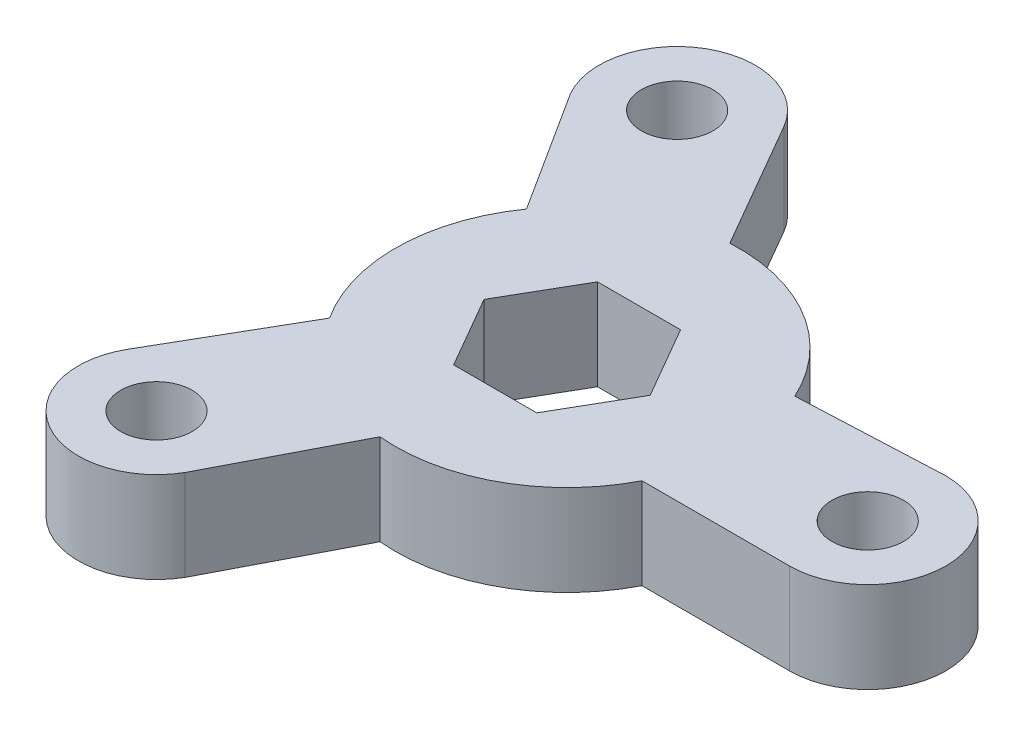
ISO-10303-21;
HEADER;
FILE_DESCRIPTION(('STEP AP214'),'2;1');
FILE_NAME('part.step','',(''),(''),'','','');
FILE_SCHEMA(('AUTOMOTIVE_DESIGN { 1 0 10303 214 1 1 1 1 }'));
ENDSEC;
DATA;
#1=APPLICATION_CONTEXT('core data for automotive mechanical design processes');
#2=APPLICATION_PROTOCOL_DEFINITION('international standard','automotive_design',2000,#1);
#3=PRODUCT_CONTEXT('',#1,'mechanical');
#4=PRODUCT('Part','Part','',(#3));
#5=PRODUCT_RELATED_PRODUCT_CATEGORY('part','',(#4));
#6=PRODUCT_DEFINITION_FORMATION('','',#4);
#7=PRODUCT_DEFINITION_CONTEXT('part definition',#1,'design');
#8=PRODUCT_DEFINITION('design','',#6,#7);
#9=PRODUCT_DEFINITION_SHAPE('','',#8);
#10=(LENGTH_UNIT() NAMED_UNIT(*) SI_UNIT(.MILLI.,.METRE.));
#11=(NAMED_UNIT(*) PLANE_ANGLE_UNIT() SI_UNIT($,.RADIAN.));
#12=(NAMED_UNIT(*) SI_UNIT($,.STERADIAN.) SOLID_ANGLE_UNIT());
#13=UNCERTAINTY_MEASURE_WITH_UNIT(LENGTH_MEASURE(1.E-05),#10,'distance_accuracy_value','');
#14=(GEOMETRIC_REPRESENTATION_CONTEXT(3) GLOBAL_UNCERTAINTY_ASSIGNED_CONTEXT((#13)) GLOBAL_UNIT_ASSIGNED_CONTEXT((#10,
#11,#12)) REPRESENTATION_CONTEXT('',''));
#15=CARTESIAN_POINT('',(0.,0.,0.));
#16=DIRECTION('',(0.,0.,1.));
#17=DIRECTION('',(1.,0.,0.));
#18=AXIS2_PLACEMENT_3D('',#15,#16,#17);
#19=CARTESIAN_POINT('',(4.16792281511756,3.175,-2.40635135926971));
#20=DIRECTION('',(-0.866025403784439,0.,0.5));
#21=DIRECTION('',(0.5,0.,0.866025403784439));
#22=AXIS2_PLACEMENT_3D('',#19,#20,#21);
#23=PLANE('',#22);
#24=DIRECTION('',(-0.5,0.,-0.866025403784439));
#25=VECTOR('',#24,1.);
#26=CARTESIAN_POINT('',(4.16792281511756,0.,-2.40635135926971));
#27=LINE('',#26,#25);
#28=CARTESIAN_POINT('',(5.41594714437485,0.,-0.244709811914002));
#29=VERTEX_POINT('',#28);
#30=CARTESIAN_POINT('',(3.96535459303568,0.,-2.75720981191441));
#31=VERTEX_POINT('',#30);
#32=EDGE_CURVE('E238',#29,#31,#27,.T.);
#33=ORIENTED_EDGE('',*,*,#32,.F.);
#34=DIRECTION('',(0.,-1.,0.));
#35=VECTOR('',#34,1.);
#36=CARTESIAN_POINT('',(5.41594714437485,3.175,-0.244709811914002));
#37=LINE('',#36,#35);
#38=CARTESIAN_POINT('',(5.41594714437485,3.175,-0.244709811914002));
#39=VERTEX_POINT('',#38);
#40=EDGE_CURVE('E11',#39,#29,#37,.T.);
#41=ORIENTED_EDGE('',*,*,#40,.F.);
#42=DIRECTION('',(-0.5,0.,-0.866025403784439));
#43=VECTOR('',#42,1.);
#44=CARTESIAN_POINT('',(4.16792281511756,3.175,-2.40635135926971));
#45=LINE('',#44,#43);
#46=CARTESIAN_POINT('',(3.96535459303568,3.175,-2.75720981191441));
#47=VERTEX_POINT('',#46);
#48=EDGE_CURVE('E339',#39,#47,#45,.T.);
#49=ORIENTED_EDGE('',*,*,#48,.T.);
#50=DIRECTION('',(0.,-1.,0.));
#51=VECTOR('',#50,1.);
#52=CARTESIAN_POINT('',(3.96535459303568,3.175,-2.75720981191441));
#53=LINE('',#52,#51);
#54=EDGE_CURVE('E54',#47,#31,#53,.T.);
#55=ORIENTED_EDGE('',*,*,#54,.T.);
#56=EDGE_LOOP('',(#33,#41,#49,#55));
#57=FACE_BOUND('',#56,.T.);
#58=ADVANCED_FACE('F35',(#57),#23,.T.);
#59=CARTESIAN_POINT('',(3.95599790144547,3.175,2.28399645331314));
#60=DIRECTION('',(-0.866025403784439,0.,-0.5));
#61=DIRECTION('',(-0.5,0.,0.866025403784439));
#62=AXIS2_PLACEMENT_3D('',#59,#60,#61);
#63=PLANE('',#62);
#64=DIRECTION('',(0.5,0.,-0.866025403784439));
#65=VECTOR('',#64,1.);
#66=CARTESIAN_POINT('',(3.95599790144547,0.,2.28399645331314));
#67=LINE('',#66,#65);
#68=CARTESIAN_POINT('',(3.96535459303568,0.,2.26779018808813));
#69=VERTEX_POINT('',#68);
#70=EDGE_CURVE('E240',#69,#29,#67,.T.);
#71=ORIENTED_EDGE('',*,*,#70,.F.);
#72=DIRECTION('',(0.,-1.,0.));
#73=VECTOR('',#72,1.);
#74=CARTESIAN_POINT('',(3.96535459303568,3.175,2.26779018808813));
#75=LINE('',#74,#73);
#76=CARTESIAN_POINT('',(3.96535459303568,3.175,2.26779018808813));
#77=VERTEX_POINT('',#76);
#78=EDGE_CURVE('E45',#77,#69,#75,.T.);
#79=ORIENTED_EDGE('',*,*,#78,.F.);
#80=DIRECTION('',(0.5,0.,-0.866025403784439));
#81=VECTOR('',#80,1.);
#82=CARTESIAN_POINT('',(3.95599790144547,3.175,2.28399645331314));
#83=LINE('',#82,#81);
#84=EDGE_CURVE('E341',#77,#39,#83,.T.);
#85=ORIENTED_EDGE('',*,*,#84,.T.);
#86=ORIENTED_EDGE('',*,*,#40,.T.);
#87=EDGE_LOOP('',(#71,#79,#85,#86));
#88=FACE_BOUND('',#87,.T.);
#89=ADVANCED_FACE('F365',(#88),#63,.T.);
#90=CARTESIAN_POINT('',(0.,3.175,2.26779018808813));
#91=DIRECTION('',(0.,0.,-1.));
#92=DIRECTION('',(-1.,0.,0.));
#93=AXIS2_PLACEMENT_3D('',#90,#91,#92);
#94=PLANE('',#93);
#95=DIRECTION('',(1.,0.,0.));
#96=VECTOR('',#95,1.);
#97=CARTESIAN_POINT('',(0.,0.,2.26779018808813));
#98=LINE('',#97,#96);
#99=CARTESIAN_POINT('',(1.06416949035638,0.,2.26779018808819));
#100=VERTEX_POINT('',#99);
#101=EDGE_CURVE('E243',#100,#69,#98,.T.);
#102=ORIENTED_EDGE('',*,*,#101,.F.);
#103=DIRECTION('',(0.,-1.,0.));
#104=VECTOR('',#103,1.);
#105=CARTESIAN_POINT('',(1.06416949035638,3.175,2.26779018808819));
#106=LINE('',#105,#104);
#107=CARTESIAN_POINT('',(1.06416949035638,3.175,2.26779018808819));
#108=VERTEX_POINT('',#107);
#109=EDGE_CURVE('E177',#108,#100,#106,.T.);
#110=ORIENTED_EDGE('',*,*,#109,.F.);
#111=DIRECTION('',(1.,0.,0.));
#112=VECTOR('',#111,1.);
#113=CARTESIAN_POINT('',(0.,3.175,2.26779018808813));
#114=LINE('',#113,#112);
#115=EDGE_CURVE('E189',#108,#77,#114,.T.);
#116=ORIENTED_EDGE('',*,*,#115,.T.);
#117=ORIENTED_EDGE('',*,*,#78,.T.);
#118=EDGE_LOOP('',(#102,#110,#116,#117));
#119=FACE_BOUND('',#118,.T.);
#120=ADVANCED_FACE('F345',(#119),#94,.T.);
#121=CARTESIAN_POINT('',(-0.183854838901459,3.175,0.106148640731575));
#122=DIRECTION('',(0.866025403784435,0.,-0.500000000000006));
#123=DIRECTION('',(-0.500000000000006,0.,-0.866025403784435));
#124=AXIS2_PLACEMENT_3D('',#121,#122,#123);
#125=PLANE('',#124);
#126=DIRECTION('',(0.500000000000006,0.,0.866025403784435));
#127=VECTOR('',#126,1.);
#128=CARTESIAN_POINT('',(-0.183854838901459,0.,0.106148640731575));
#129=LINE('',#128,#127);
#130=CARTESIAN_POINT('',(-0.386423060983354,0.,-0.244709811913157));
#131=VERTEX_POINT('',#130);
#132=EDGE_CURVE('E173',#131,#100,#129,.T.);
#133=ORIENTED_EDGE('',*,*,#132,.F.);
#134=DIRECTION('',(0.,-1.,0.));
#135=VECTOR('',#134,1.);
#136=CARTESIAN_POINT('',(-0.386423060983354,3.175,-0.244709811913157));
#137=LINE('',#136,#135);
#138=CARTESIAN_POINT('',(-0.386423060983354,3.175,-0.244709811913157));
#139=VERTEX_POINT('',#138);
#140=EDGE_CURVE('E168',#139,#131,#137,.T.);
#141=ORIENTED_EDGE('',*,*,#140,.F.);
#142=DIRECTION('',(0.500000000000006,0.,0.866025403784435));
#143=VECTOR('',#142,1.);
#144=CARTESIAN_POINT('',(-0.183854838901459,3.175,0.106148640731575));
#145=LINE('',#144,#143);
#146=EDGE_CURVE('E171',#139,#108,#145,.T.);
#147=ORIENTED_EDGE('',*,*,#146,.T.);
#148=ORIENTED_EDGE('',*,*,#109,.T.);
#149=EDGE_LOOP('',(#133,#141,#147,#148));
#150=FACE_BOUND('',#149,.T.);
#151=ADVANCED_FACE('F170',(#150),#125,.T.);
#152=CARTESIAN_POINT('',(-0.395779752573566,3.175,-0.228503546688159));
#153=DIRECTION('',(0.866025403784432,0.,0.500000000000012));
#154=DIRECTION('',(0.500000000000012,0.,-0.866025403784432));
#155=AXIS2_PLACEMENT_3D('',#152,#153,#154);
#156=PLANE('',#155);
#157=DIRECTION('',(-0.500000000000012,0.,0.866025403784432));
#158=VECTOR('',#157,1.);
#159=CARTESIAN_POINT('',(-0.395779752573566,0.,-0.228503546688159));
#160=LINE('',#159,#158);
#161=CARTESIAN_POINT('',(1.06416949035712,0.,-2.75720981191441));
#162=VERTEX_POINT('',#161);
#163=EDGE_CURVE('E247',#162,#131,#160,.T.);
#164=ORIENTED_EDGE('',*,*,#163,.F.);
#165=DIRECTION('',(0.,-1.,0.));
#166=VECTOR('',#165,1.);
#167=CARTESIAN_POINT('',(1.06416949035712,3.175,-2.75720981191441));
#168=LINE('',#167,#166);
#169=CARTESIAN_POINT('',(1.06416949035712,3.175,-2.75720981191441));
#170=VERTEX_POINT('',#169);
#171=EDGE_CURVE('E109',#170,#162,#168,.T.);
#172=ORIENTED_EDGE('',*,*,#171,.F.);
#173=DIRECTION('',(-0.500000000000012,0.,0.866025403784432));
#174=VECTOR('',#173,1.);
#175=CARTESIAN_POINT('',(-0.395779752573566,3.175,-0.228503546688159));
#176=LINE('',#175,#174);
#177=EDGE_CURVE('E186',#170,#139,#176,.T.);
#178=ORIENTED_EDGE('',*,*,#177,.T.);
#179=ORIENTED_EDGE('',*,*,#140,.T.);
#180=EDGE_LOOP('',(#164,#172,#178,#179));
#181=FACE_BOUND('',#180,.T.);
#182=ADVANCED_FACE('F191',(#181),#156,.T.);
#183=CARTESIAN_POINT('',(3.87987291900672,3.175,2.01140464348408));
#184=DIRECTION('',(-0.887790184262467,0.,-0.460248398940414));
#185=DIRECTION('',(-0.460248398940414,0.,0.887790184262467));
#186=AXIS2_PLACEMENT_3D('',#183,#184,#185);
#187=PLANE('',#186);
#188=DIRECTION('',(0.460248398940414,0.,-0.887790184262467));
#189=VECTOR('',#188,1.);
#190=CARTESIAN_POINT('',(3.87987291900672,0.,2.01140464348408));
#191=LINE('',#190,#189);
#192=CARTESIAN_POINT('',(-0.371989304252298,0.,10.2129791744026));
#193=VERTEX_POINT('',#192);
#194=CARTESIAN_POINT('',(1.95264752249864,0.,5.72890109500861));
#195=VERTEX_POINT('',#194);
#196=EDGE_CURVE('E207',#193,#195,#191,.T.);
#197=ORIENTED_EDGE('',*,*,#196,.T.);
#198=DIRECTION('',(0.,-1.,0.));
#199=VECTOR('',#198,1.);
#200=CARTESIAN_POINT('',(1.95264752249864,3.175,5.72890109500861));
#201=LINE('',#200,#199);
#202=CARTESIAN_POINT('',(1.95264752249864,3.175,5.72890109500861));
#203=VERTEX_POINT('',#202);
#204=EDGE_CURVE('E39',#203,#195,#201,.T.);
#205=ORIENTED_EDGE('',*,*,#204,.F.);
#206=DIRECTION('',(0.460248398940414,0.,-0.887790184262467));
#207=VECTOR('',#206,1.);
#208=CARTESIAN_POINT('',(3.87987291900672,3.175,2.01140464348408));
#209=LINE('',#208,#207);
#210=CARTESIAN_POINT('',(-0.371989304252298,3.175,10.2129791744026));
#211=VERTEX_POINT('',#210);
#212=EDGE_CURVE('E261',#211,#203,#209,.T.);
#213=ORIENTED_EDGE('',*,*,#212,.F.);
#214=DIRECTION('',(0.,-1.,0.));
#215=VECTOR('',#214,1.);
#216=CARTESIAN_POINT('',(-0.371989304252298,3.175,10.2129791744026));
#217=LINE('',#216,#215);
#218=EDGE_CURVE('E206',#211,#193,#217,.T.);
#219=ORIENTED_EDGE('',*,*,#218,.T.);
#220=EDGE_LOOP('',(#197,#205,#213,#219));
#221=FACE_BOUND('',#220,.T.);
#222=ADVANCED_FACE('F37',(#221),#187,.F.);
#223=CARTESIAN_POINT('',(2.51476204169658,3.175,-0.244709811914002));
#224=DIRECTION('',(0.,-1.,0.));
#225=DIRECTION('',(0.,0.,-1.));
#226=AXIS2_PLACEMENT_3D('',#223,#224,#225);
#227=CYLINDRICAL_SURFACE('',#226,5.99999999999883);
#228=CARTESIAN_POINT('',(2.51476204169658,0.,-0.244709811914002));
#229=DIRECTION('',(0.,1.,0.));
#230=DIRECTION('',(0.,0.,1.));
#231=AXIS2_PLACEMENT_3D('',#228,#229,#230);
#232=CIRCLE('',#231,5.99999999999883);
#233=CARTESIAN_POINT('',(7.85830091889646,0.,2.48413468124454));
#234=VERTEX_POINT('',#233);
#235=EDGE_CURVE('E210',#195,#234,#232,.T.);
#236=ORIENTED_EDGE('',*,*,#235,.T.);
#237=DIRECTION('',(0.,-1.,0.));
#238=VECTOR('',#237,1.);
#239=CARTESIAN_POINT('',(7.85830091889646,3.175,2.48413468124454));
#240=LINE('',#239,#238);
#241=CARTESIAN_POINT('',(7.85830091889646,3.175,2.48413468124454));
#242=VERTEX_POINT('',#241);
#243=EDGE_CURVE('E289',#242,#234,#240,.T.);
#244=ORIENTED_EDGE('',*,*,#243,.F.);
#245=CARTESIAN_POINT('',(2.51476204169658,3.175,-0.244709811914002));
#246=DIRECTION('',(0.,1.,0.));
#247=DIRECTION('',(0.,0.,1.));
#248=AXIS2_PLACEMENT_3D('',#245,#246,#247);
#249=CIRCLE('',#248,5.99999999999883);
#250=EDGE_CURVE('E122',#203,#242,#249,.T.);
#251=ORIENTED_EDGE('',*,*,#250,.F.);
#252=ORIENTED_EDGE('',*,*,#204,.T.);
#253=EDGE_LOOP('',(#236,#244,#251,#252));
#254=FACE_BOUND('',#253,.T.);
#255=ADVANCED_FACE('F294',(#254),#227,.T.);
#256=CARTESIAN_POINT('',(0.,3.175,2.48413468124462));
#257=DIRECTION('',(0.,0.,1.));
#258=DIRECTION('',(1.,0.,0.));
#259=AXIS2_PLACEMENT_3D('',#256,#257,#258);
#260=PLANE('',#259);
#261=DIRECTION('',(-1.,0.,0.));
#262=VECTOR('',#261,1.);
#263=CARTESIAN_POINT('',(0.,0.,2.48413468124462));
#264=LINE('',#263,#262);
#265=CARTESIAN_POINT('',(13.0147620416956,0.,2.48413468124462));
#266=VERTEX_POINT('',#265);
#267=EDGE_CURVE('E213',#266,#234,#264,.T.);
#268=ORIENTED_EDGE('',*,*,#267,.F.);
#269=DIRECTION('',(0.,-1.,0.));
#270=VECTOR('',#269,1.);
#271=CARTESIAN_POINT('',(13.0147620416956,3.175,2.48413468124462));
#272=LINE('',#271,#270);
#273=CARTESIAN_POINT('',(13.0147620416956,3.175,2.48413468124462));
#274=VERTEX_POINT('',#273);
#275=EDGE_CURVE('E288',#274,#266,#272,.T.);
#276=ORIENTED_EDGE('',*,*,#275,.F.);
#277=DIRECTION('',(-1.,0.,0.));
#278=VECTOR('',#277,1.);
#279=CARTESIAN_POINT('',(0.,3.175,2.48413468124462));
#280=LINE('',#279,#278);
#281=EDGE_CURVE('E309',#274,#242,#280,.T.);
#282=ORIENTED_EDGE('',*,*,#281,.T.);
#283=ORIENTED_EDGE('',*,*,#243,.T.);
#284=EDGE_LOOP('',(#268,#276,#282,#283));
#285=FACE_BOUND('',#284,.T.);
#286=ADVANCED_FACE('F306',(#285),#260,.T.);
#287=CARTESIAN_POINT('',(13.0147620416956,3.175,-0.244709811913141));
#288=DIRECTION('',(0.,-1.,0.));
#289=DIRECTION('',(0.,0.,-1.));
#290=AXIS2_PLACEMENT_3D('',#287,#288,#289);
#291=CYLINDRICAL_SURFACE('',#290,2.72884449315776);
#292=CARTESIAN_POINT('',(13.0147620416956,0.,-0.244709811913141));
#293=DIRECTION('',(0.,1.,0.));
#294=DIRECTION('',(0.,0.,1.));
#295=AXIS2_PLACEMENT_3D('',#292,#293,#294);
#296=CIRCLE('',#295,2.72884449315776);
#297=CARTESIAN_POINT('',(13.0147620416966,0.,-2.97355430507091));
#298=VERTEX_POINT('',#297);
#299=EDGE_CURVE('E216',#266,#298,#296,.T.);
#300=ORIENTED_EDGE('',*,*,#299,.T.);
#301=DIRECTION('',(0.,-1.,0.));
#302=VECTOR('',#301,1.);
#303=CARTESIAN_POINT('',(13.0147620416966,3.175,-2.97355430507091));
#304=LINE('',#303,#302);
#305=CARTESIAN_POINT('',(13.0147620416966,3.175,-2.97355430507091));
#306=VERTEX_POINT('',#305);
#307=EDGE_CURVE('E285',#306,#298,#304,.T.);
#308=ORIENTED_EDGE('',*,*,#307,.F.);
#309=CARTESIAN_POINT('',(13.0147620416956,3.175,-0.244709811913141));
#310=DIRECTION('',(0.,1.,0.));
#311=DIRECTION('',(0.,0.,1.));
#312=AXIS2_PLACEMENT_3D('',#309,#310,#311);
#313=CIRCLE('',#312,2.72884449315776);
#314=EDGE_CURVE('E312',#274,#306,#313,.T.);
#315=ORIENTED_EDGE('',*,*,#314,.F.);
#316=ORIENTED_EDGE('',*,*,#275,.T.);
#317=EDGE_LOOP('',(#300,#308,#315,#316));
#318=FACE_BOUND('',#317,.T.);
#319=ADVANCED_FACE('F313',(#318),#291,.T.);
#320=CARTESIAN_POINT('',(-0.107871058470792,3.175,-2.37837906979592));
#321=DIRECTION('',(0.045308286597738,0.,0.998973052271971));
#322=DIRECTION('',(0.998973052271971,0.,-0.045308286597738));
#323=AXIS2_PLACEMENT_3D('',#320,#321,#322);
#324=PLANE('',#323);
#325=DIRECTION('',(-0.998973052271971,0.,0.045308286597738));
#326=VECTOR('',#325,1.);
#327=CARTESIAN_POINT('',(-0.107871058470792,0.,-2.37837906979592));
#328=LINE('',#327,#326);
#329=CARTESIAN_POINT('',(7.96911809901369,0.,-2.7447098119133));
#330=VERTEX_POINT('',#329);
#331=EDGE_CURVE('E218',#298,#330,#328,.T.);
#332=ORIENTED_EDGE('',*,*,#331,.T.);
#333=DIRECTION('',(0.,-1.,0.));
#334=VECTOR('',#333,1.);
#335=CARTESIAN_POINT('',(7.96911809901369,3.175,-2.7447098119133));
#336=LINE('',#335,#334);
#337=CARTESIAN_POINT('',(7.96911809901369,3.175,-2.7447098119133));
#338=VERTEX_POINT('',#337);
#339=EDGE_CURVE('E282',#338,#330,#336,.T.);
#340=ORIENTED_EDGE('',*,*,#339,.F.);
#341=DIRECTION('',(-0.998973052271971,0.,0.045308286597738));
#342=VECTOR('',#341,1.);
#343=CARTESIAN_POINT('',(-0.107871058470792,3.175,-2.37837906979592));
#344=LINE('',#343,#342);
#345=EDGE_CURVE('E316',#306,#338,#344,.T.);
#346=ORIENTED_EDGE('',*,*,#345,.F.);
#347=ORIENTED_EDGE('',*,*,#307,.T.);
#348=EDGE_LOOP('',(#332,#340,#346,#347));
#349=FACE_BOUND('',#348,.T.);
#350=ADVANCED_FACE('F397',(#349),#324,.F.);
#351=CARTESIAN_POINT('',(2.51476204169658,3.175,-0.244709811914002));
#352=DIRECTION('',(0.,-1.,0.));
#353=DIRECTION('',(0.,0.,-1.));
#354=AXIS2_PLACEMENT_3D('',#351,#352,#353);
#355=CYLINDRICAL_SURFACE('',#354,5.99999999999883);
#356=CARTESIAN_POINT('',(2.51476204169658,0.,-0.244709811914002));
#357=DIRECTION('',(0.,1.,0.));
#358=DIRECTION('',(0.,0.,1.));
#359=AXIS2_PLACEMENT_3D('',#356,#357,#358);
#360=CIRCLE('',#359,5.99999999999883);
#361=CARTESIAN_POINT('',(2.20624125714759,0.,-6.2367724722577));
#362=VERTEX_POINT('',#361);
#363=EDGE_CURVE('E220',#330,#362,#360,.T.);
#364=ORIENTED_EDGE('',*,*,#363,.T.);
#365=DIRECTION('',(0.,-1.,0.));
#366=VECTOR('',#365,1.);
#367=CARTESIAN_POINT('',(2.20624125714759,3.175,-6.2367724722577));
#368=LINE('',#367,#366);
#369=CARTESIAN_POINT('',(2.20624125714759,3.175,-6.2367724722577));
#370=VERTEX_POINT('',#369);
#371=EDGE_CURVE('E280',#370,#362,#368,.T.);
#372=ORIENTED_EDGE('',*,*,#371,.F.);
#373=CARTESIAN_POINT('',(2.51476204169658,3.175,-0.244709811914002));
#374=DIRECTION('',(0.,1.,0.));
#375=DIRECTION('',(0.,0.,1.));
#376=AXIS2_PLACEMENT_3D('',#373,#374,#375);
#377=CIRCLE('',#376,5.99999999999883);
#378=EDGE_CURVE('E323',#338,#370,#377,.T.);
#379=ORIENTED_EDGE('',*,*,#378,.F.);
#380=ORIENTED_EDGE('',*,*,#339,.T.);
#381=EDGE_LOOP('',(#364,#372,#379,#380));
#382=FACE_BOUND('',#381,.T.);
#383=ADVANCED_FACE('F393',(#382),#355,.T.);
#384=CARTESIAN_POINT('',(4.35528264215995,3.175,-2.51452360584794));
#385=DIRECTION('',(0.866025403784439,0.,-0.499999999999999));
#386=DIRECTION('',(-0.499999999999999,0.,-0.866025403784439));
#387=AXIS2_PLACEMENT_3D('',#384,#385,#386);
#388=PLANE('',#387);
#389=DIRECTION('',(0.499999999999999,0.,0.866025403784439));
#390=VECTOR('',#389,1.);
#391=CARTESIAN_POINT('',(4.35528264215995,0.,-2.51452360584794));
#392=LINE('',#391,#390);
#393=CARTESIAN_POINT('',(-0.371989304251888,0.,-10.7023987982283));
#394=VERTEX_POINT('',#393);
#395=EDGE_CURVE('E223',#394,#362,#392,.T.);
#396=ORIENTED_EDGE('',*,*,#395,.F.);
#397=DIRECTION('',(0.,-1.,0.));
#398=VECTOR('',#397,1.);
#399=CARTESIAN_POINT('',(-0.371989304251888,3.175,-10.7023987982283));
#400=LINE('',#399,#398);
#401=CARTESIAN_POINT('',(-0.371989304251888,3.175,-10.7023987982283));
#402=VERTEX_POINT('',#401);
#403=EDGE_CURVE('E278',#402,#394,#400,.T.);
#404=ORIENTED_EDGE('',*,*,#403,.F.);
#405=DIRECTION('',(0.499999999999999,0.,0.866025403784439));
#406=VECTOR('',#405,1.);
#407=CARTESIAN_POINT('',(4.35528264215995,3.175,-2.51452360584794));
#408=LINE('',#407,#406);
#409=EDGE_CURVE('E325',#402,#370,#408,.T.);
#410=ORIENTED_EDGE('',*,*,#409,.T.);
#411=ORIENTED_EDGE('',*,*,#371,.T.);
#412=EDGE_LOOP('',(#396,#404,#410,#411));
#413=FACE_BOUND('',#412,.T.);
#414=ADVANCED_FACE('F389',(#413),#388,.T.);
#415=CARTESIAN_POINT('',(-2.73523795830378,3.175,-9.3379765516494));
#416=DIRECTION('',(0.,-1.,0.));
#417=DIRECTION('',(0.,0.,-1.));
#418=AXIS2_PLACEMENT_3D('',#415,#416,#417);
#419=CYLINDRICAL_SURFACE('',#418,2.72884449315776);
#420=CARTESIAN_POINT('',(-2.73523795830378,0.,-9.3379765516494));
#421=DIRECTION('',(0.,1.,0.));
#422=DIRECTION('',(0.,0.,1.));
#423=AXIS2_PLACEMENT_3D('',#420,#421,#422);
#424=CIRCLE('',#423,2.72884449315776);
#425=CARTESIAN_POINT('',(-5.09848661235614,0.,-7.97355430507133));
#426=VERTEX_POINT('',#425);
#427=EDGE_CURVE('E226',#394,#426,#424,.T.);
#428=ORIENTED_EDGE('',*,*,#427,.T.);
#429=DIRECTION('',(0.,-1.,0.));
#430=VECTOR('',#429,1.);
#431=CARTESIAN_POINT('',(-5.09848661235614,3.175,-7.97355430507133));
#432=LINE('',#431,#430);
#433=CARTESIAN_POINT('',(-5.09848661235614,3.175,-7.97355430507133));
#434=VERTEX_POINT('',#433);
#435=EDGE_CURVE('E275',#434,#426,#432,.T.);
#436=ORIENTED_EDGE('',*,*,#435,.F.);
#437=CARTESIAN_POINT('',(-2.73523795830378,3.175,-9.3379765516494));
#438=DIRECTION('',(0.,1.,0.));
#439=DIRECTION('',(0.,0.,1.));
#440=AXIS2_PLACEMENT_3D('',#437,#438,#439);
#441=CIRCLE('',#440,2.72884449315776);
#442=EDGE_CURVE('E328',#402,#434,#441,.T.);
#443=ORIENTED_EDGE('',*,*,#442,.F.);
#444=ORIENTED_EDGE('',*,*,#403,.T.);
#445=EDGE_LOOP('',(#428,#436,#443,#444));
#446=FACE_BOUND('',#445,.T.);
#447=ADVANCED_FACE('F385',(#446),#419,.T.);
#448=CARTESIAN_POINT('',(0.000141202008173699,3.175,-9.02915577342994E-05));
#449=DIRECTION('',(0.842481897664738,0.,-0.538724653331571));
#450=DIRECTION('',(-0.538724653331571,0.,-0.842481897664738));
#451=AXIS2_PLACEMENT_3D('',#448,#449,#450);
#452=PLANE('',#451);
#453=DIRECTION('',(0.538724653331571,0.,0.842481897664738));
#454=VECTOR('',#453,1.);
#455=CARTESIAN_POINT('',(0.000141202008173699,0.,-9.02915577342994E-05));
#456=LINE('',#455,#454);
#457=CARTESIAN_POINT('',(-2.37747949642372,0.,-3.71832071883545));
#458=VERTEX_POINT('',#457);
#459=EDGE_CURVE('E228',#426,#458,#456,.T.);
#460=ORIENTED_EDGE('',*,*,#459,.T.);
#461=DIRECTION('',(0.,-1.,0.));
#462=VECTOR('',#461,1.);
#463=CARTESIAN_POINT('',(-2.37747949642372,3.175,-3.71832071883545));
#464=LINE('',#463,#462);
#465=CARTESIAN_POINT('',(-2.37747949642372,3.175,-3.71832071883545));
#466=VERTEX_POINT('',#465);
#467=EDGE_CURVE('E272',#466,#458,#464,.T.);
#468=ORIENTED_EDGE('',*,*,#467,.F.);
#469=DIRECTION('',(0.538724653331571,0.,0.842481897664738));
#470=VECTOR('',#469,1.);
#471=CARTESIAN_POINT('',(0.000141202008173699,3.175,-9.02915577342994E-05));
#472=LINE('',#471,#470);
#473=EDGE_CURVE('E330',#434,#466,#472,.T.);
#474=ORIENTED_EDGE('',*,*,#473,.F.);
#475=ORIENTED_EDGE('',*,*,#435,.T.);
#476=EDGE_LOOP('',(#460,#468,#474,#475));
#477=FACE_BOUND('',#476,.T.);
#478=ADVANCED_FACE('F381',(#477),#452,.F.);
#479=CARTESIAN_POINT('',(2.51476204169658,3.175,-0.244709811914002));
#480=DIRECTION('',(0.,-1.,0.));
#481=DIRECTION('',(0.,0.,-1.));
#482=AXIS2_PLACEMENT_3D('',#479,#480,#481);
#483=CYLINDRICAL_SURFACE('',#482,5.99999999999883);
#484=CARTESIAN_POINT('',(2.51476204169658,0.,-0.244709811914002));
#485=DIRECTION('',(0.,1.,0.));
#486=DIRECTION('',(0.,0.,1.));
#487=AXIS2_PLACEMENT_3D('',#484,#485,#486);
#488=CIRCLE('',#487,5.99999999999883);
#489=CARTESIAN_POINT('',(-2.5202560509557,0.,3.01850835527313));
#490=VERTEX_POINT('',#489);
#491=EDGE_CURVE('E230',#458,#490,#488,.T.);
#492=ORIENTED_EDGE('',*,*,#491,.T.);
#493=DIRECTION('',(0.,-1.,0.));
#494=VECTOR('',#493,1.);
#495=CARTESIAN_POINT('',(-2.5202560509557,3.175,3.01850835527313));
#496=LINE('',#495,#494);
#497=CARTESIAN_POINT('',(-2.5202560509557,3.175,3.01850835527313));
#498=VERTEX_POINT('',#497);
#499=EDGE_CURVE('E270',#498,#490,#496,.T.);
#500=ORIENTED_EDGE('',*,*,#499,.F.);
#501=CARTESIAN_POINT('',(2.51476204169658,3.175,-0.244709811914002));
#502=DIRECTION('',(0.,1.,0.));
#503=DIRECTION('',(0.,0.,1.));
#504=AXIS2_PLACEMENT_3D('',#501,#502,#503);
#505=CIRCLE('',#504,5.99999999999883);
#506=EDGE_CURVE('E332',#466,#498,#505,.T.);
#507=ORIENTED_EDGE('',*,*,#506,.F.);
#508=ORIENTED_EDGE('',*,*,#467,.T.);
#509=EDGE_LOOP('',(#492,#500,#507,#508));
#510=FACE_BOUND('',#509,.T.);
#511=ADVANCED_FACE('F377',(#510),#483,.T.);
#512=CARTESIAN_POINT('',(-0.583139579616138,3.175,-0.336675793266482));
#513=DIRECTION('',(-0.866025403784452,0.,-0.499999999999977));
#514=DIRECTION('',(-0.499999999999977,0.,0.866025403784452));
#515=AXIS2_PLACEMENT_3D('',#512,#513,#514);
#516=PLANE('',#515);
#517=DIRECTION('',(0.499999999999977,0.,-0.866025403784452));
#518=VECTOR('',#517,1.);
#519=CARTESIAN_POINT('',(-0.583139579616138,0.,-0.336675793266482));
#520=LINE('',#519,#518);
#521=CARTESIAN_POINT('',(-5.09848661235567,0.,7.48413468124424));
#522=VERTEX_POINT('',#521);
#523=EDGE_CURVE('E233',#522,#490,#520,.T.);
#524=ORIENTED_EDGE('',*,*,#523,.F.);
#525=DIRECTION('',(0.,-1.,0.));
#526=VECTOR('',#525,1.);
#527=CARTESIAN_POINT('',(-5.09848661235567,3.175,7.48413468124424));
#528=LINE('',#527,#526);
#529=CARTESIAN_POINT('',(-5.09848661235567,3.175,7.48413468124424));
#530=VERTEX_POINT('',#529);
#531=EDGE_CURVE('E268',#530,#522,#528,.T.);
#532=ORIENTED_EDGE('',*,*,#531,.F.);
#533=DIRECTION('',(0.499999999999977,0.,-0.866025403784452));
#534=VECTOR('',#533,1.);
#535=CARTESIAN_POINT('',(-0.583139579616138,3.175,-0.336675793266482));
#536=LINE('',#535,#534);
#537=EDGE_CURVE('E334',#530,#498,#536,.T.);
#538=ORIENTED_EDGE('',*,*,#537,.T.);
#539=ORIENTED_EDGE('',*,*,#499,.T.);
#540=EDGE_LOOP('',(#524,#532,#538,#539));
#541=FACE_BOUND('',#540,.T.);
#542=ADVANCED_FACE('F374',(#541),#516,.T.);
#543=CARTESIAN_POINT('',(13.0147620416966,3.175,-0.244709811914002));
#544=DIRECTION('',(0.,-1.,0.));
#545=DIRECTION('',(0.,0.,-1.));
#546=AXIS2_PLACEMENT_3D('',#543,#544,#545);
#547=CYLINDRICAL_SURFACE('',#546,1.24999999999883);
#548=CARTESIAN_POINT('',(13.0147620416966,3.175,-0.244709811914002));
#549=DIRECTION('',(0.,1.,0.));
#550=DIRECTION('',(0.,0.,1.));
#551=AXIS2_PLACEMENT_3D('',#548,#549,#550);
#552=CIRCLE('',#551,1.24999999999883);
#553=CARTESIAN_POINT('',(13.0147620416966,3.175,1.00529018808482));
#554=VERTEX_POINT('',#553);
#555=EDGE_CURVE('E200',#554,#554,#552,.T.);
#556=ORIENTED_EDGE('',*,*,#555,.T.);
#557=EDGE_LOOP('',(#556));
#558=FACE_BOUND('',#557,.T.);
#559=CARTESIAN_POINT('',(13.0147620416966,0.,-0.244709811914002));
#560=DIRECTION('',(0.,1.,0.));
#561=DIRECTION('',(0.,0.,1.));
#562=AXIS2_PLACEMENT_3D('',#559,#560,#561);
#563=CIRCLE('',#562,1.24999999999883);
#564=CARTESIAN_POINT('',(13.0147620416966,0.,1.00529018808482));
#565=VERTEX_POINT('',#564);
#566=EDGE_CURVE('E255',#565,#565,#563,.T.);
#567=ORIENTED_EDGE('',*,*,#566,.F.);
#568=EDGE_LOOP('',(#567));
#569=FACE_BOUND('',#568,.T.);
#570=ADVANCED_FACE('F360',(#558,#569),#547,.F.);
#571=CARTESIAN_POINT('',(-2.73523795830378,3.175,-9.3379765516494));
#572=DIRECTION('',(0.,-1.,0.));
#573=DIRECTION('',(0.,0.,-1.));
#574=AXIS2_PLACEMENT_3D('',#571,#572,#573);
#575=CYLINDRICAL_SURFACE('',#574,1.24999999999961);
#576=CARTESIAN_POINT('',(-2.73523795830378,3.175,-9.3379765516494));
#577=DIRECTION('',(0.,1.,0.));
#578=DIRECTION('',(0.,0.,1.));
#579=AXIS2_PLACEMENT_3D('',#576,#577,#578);
#580=CIRCLE('',#579,1.24999999999961);
#581=CARTESIAN_POINT('',(-2.73523795830378,3.175,-8.08797655164979));
#582=VERTEX_POINT('',#581);
#583=EDGE_CURVE('E194',#582,#582,#580,.T.);
#584=ORIENTED_EDGE('',*,*,#583,.T.);
#585=EDGE_LOOP('',(#584));
#586=FACE_BOUND('',#585,.T.);
#587=CARTESIAN_POINT('',(-2.73523795830378,0.,-9.3379765516494));
#588=DIRECTION('',(0.,1.,0.));
#589=DIRECTION('',(0.,0.,1.));
#590=AXIS2_PLACEMENT_3D('',#587,#588,#589);
#591=CIRCLE('',#590,1.24999999999961);
#592=CARTESIAN_POINT('',(-2.73523795830378,0.,-8.08797655164979));
#593=VERTEX_POINT('',#592);
#594=EDGE_CURVE('E252',#593,#593,#591,.T.);
#595=ORIENTED_EDGE('',*,*,#594,.F.);
#596=EDGE_LOOP('',(#595));
#597=FACE_BOUND('',#596,.T.);
#598=ADVANCED_FACE('F351',(#586,#597),#575,.F.);
#599=CARTESIAN_POINT('',(0.,3.175,-2.75720981191441));
#600=DIRECTION('',(0.,0.,1.));
#601=DIRECTION('',(1.,0.,0.));
#602=AXIS2_PLACEMENT_3D('',#599,#600,#601);
#603=PLANE('',#602);
#604=DIRECTION('',(-1.,0.,0.));
#605=VECTOR('',#604,1.);
#606=CARTESIAN_POINT('',(0.,0.,-2.75720981191441));
#607=LINE('',#606,#605);
#608=EDGE_CURVE('E249',#31,#162,#607,.T.);
#609=ORIENTED_EDGE('',*,*,#608,.F.);
#610=ORIENTED_EDGE('',*,*,#54,.F.);
#611=DIRECTION('',(-1.,0.,0.));
#612=VECTOR('',#611,1.);
#613=CARTESIAN_POINT('',(0.,3.175,-2.75720981191441));
#614=LINE('',#613,#612);
#615=EDGE_CURVE('E192',#47,#170,#614,.T.);
#616=ORIENTED_EDGE('',*,*,#615,.T.);
#617=ORIENTED_EDGE('',*,*,#171,.T.);
#618=EDGE_LOOP('',(#609,#610,#616,#617));
#619=FACE_BOUND('',#618,.T.);
#620=ADVANCED_FACE('F348',(#619),#603,.T.);
#621=CARTESIAN_POINT('',(-2.73523795830378,3.175,8.84855692782312));
#622=DIRECTION('',(0.,-1.,0.));
#623=DIRECTION('',(0.,0.,-1.));
#624=AXIS2_PLACEMENT_3D('',#621,#622,#623);
#625=CYLINDRICAL_SURFACE('',#624,2.72884449315774);
#626=CARTESIAN_POINT('',(-2.73523795830378,0.,8.84855692782312));
#627=DIRECTION('',(0.,1.,0.));
#628=DIRECTION('',(0.,0.,1.));
#629=AXIS2_PLACEMENT_3D('',#626,#627,#628);
#630=CIRCLE('',#629,2.72884449315774);
#631=EDGE_CURVE('E236',#522,#193,#630,.T.);
#632=ORIENTED_EDGE('',*,*,#631,.T.);
#633=ORIENTED_EDGE('',*,*,#218,.F.);
#634=CARTESIAN_POINT('',(-2.73523795830378,3.175,8.84855692782312));
#635=DIRECTION('',(0.,1.,0.));
#636=DIRECTION('',(0.,0.,1.));
#637=AXIS2_PLACEMENT_3D('',#634,#635,#636);
#638=CIRCLE('',#637,2.72884449315774);
#639=EDGE_CURVE('E337',#530,#211,#638,.T.);
#640=ORIENTED_EDGE('',*,*,#639,.F.);
#641=ORIENTED_EDGE('',*,*,#531,.T.);
#642=EDGE_LOOP('',(#632,#633,#640,#641));
#643=FACE_BOUND('',#642,.T.);
#644=ADVANCED_FACE('F350',(#643),#625,.T.);
#645=CARTESIAN_POINT('',(-2.73523795830342,3.175,8.8485569278226));
#646=DIRECTION('',(0.,-1.,0.));
#647=DIRECTION('',(0.,0.,-1.));
#648=AXIS2_PLACEMENT_3D('',#645,#646,#647);
#649=CYLINDRICAL_SURFACE('',#648,1.24999999999879);
#650=CARTESIAN_POINT('',(-2.73523795830342,3.175,8.8485569278226));
#651=DIRECTION('',(0.,1.,0.));
#652=DIRECTION('',(0.,0.,1.));
#653=AXIS2_PLACEMENT_3D('',#650,#651,#652);
#654=CIRCLE('',#653,1.24999999999879);
#655=CARTESIAN_POINT('',(-2.73523795830342,3.175,10.0985569278214));
#656=VERTEX_POINT('',#655);
#657=EDGE_CURVE('E203',#656,#656,#654,.T.);
#658=ORIENTED_EDGE('',*,*,#657,.T.);
#659=EDGE_LOOP('',(#658));
#660=FACE_BOUND('',#659,.T.);
#661=CARTESIAN_POINT('',(-2.73523795830342,0.,8.8485569278226));
#662=DIRECTION('',(0.,1.,0.));
#663=DIRECTION('',(0.,0.,1.));
#664=AXIS2_PLACEMENT_3D('',#661,#662,#663);
#665=CIRCLE('',#664,1.24999999999879);
#666=CARTESIAN_POINT('',(-2.73523795830342,0.,10.0985569278214));
#667=VERTEX_POINT('',#666);
#668=EDGE_CURVE('E258',#667,#667,#665,.T.);
#669=ORIENTED_EDGE('',*,*,#668,.F.);
#670=EDGE_LOOP('',(#669));
#671=FACE_BOUND('',#670,.T.);
#672=ADVANCED_FACE('F357',(#660,#671),#649,.F.);
#673=CARTESIAN_POINT('',(0.,3.175,0.));
#674=DIRECTION('',(0.,1.,0.));
#675=DIRECTION('',(0.,0.,1.));
#676=AXIS2_PLACEMENT_3D('',#673,#674,#675);
#677=PLANE('',#676);
#678=ORIENTED_EDGE('',*,*,#212,.T.);
#679=ORIENTED_EDGE('',*,*,#250,.T.);
#680=ORIENTED_EDGE('',*,*,#281,.F.);
#681=ORIENTED_EDGE('',*,*,#314,.T.);
#682=ORIENTED_EDGE('',*,*,#345,.T.);
#683=ORIENTED_EDGE('',*,*,#378,.T.);
#684=ORIENTED_EDGE('',*,*,#409,.F.);
#685=ORIENTED_EDGE('',*,*,#442,.T.);
#686=ORIENTED_EDGE('',*,*,#473,.T.);
#687=ORIENTED_EDGE('',*,*,#506,.T.);
#688=ORIENTED_EDGE('',*,*,#537,.F.);
#689=ORIENTED_EDGE('',*,*,#639,.T.);
#690=EDGE_LOOP('',(#678,#679,#680,#681,#682,#683,#684,#685,#686,#687,#688,#689));
#691=FACE_BOUND('',#690,.T.);
#692=ORIENTED_EDGE('',*,*,#48,.F.);
#693=ORIENTED_EDGE('',*,*,#84,.F.);
#694=ORIENTED_EDGE('',*,*,#115,.F.);
#695=ORIENTED_EDGE('',*,*,#146,.F.);
#696=ORIENTED_EDGE('',*,*,#177,.F.);
#697=ORIENTED_EDGE('',*,*,#615,.F.);
#698=EDGE_LOOP('',(#692,#693,#694,#695,#696,#697));
#699=FACE_BOUND('',#698,.T.);
#700=ORIENTED_EDGE('',*,*,#583,.F.);
#701=EDGE_LOOP('',(#700));
#702=FACE_BOUND('',#701,.T.);
#703=ORIENTED_EDGE('',*,*,#555,.F.);
#704=EDGE_LOOP('',(#703));
#705=FACE_BOUND('',#704,.T.);
#706=ORIENTED_EDGE('',*,*,#657,.F.);
#707=EDGE_LOOP('',(#706));
#708=FACE_BOUND('',#707,.T.);
#709=ADVANCED_FACE('F183',(#691,#699,#702,#705,#708),#677,.T.);
#710=CARTESIAN_POINT('',(0.,0.,0.));
#711=DIRECTION('',(0.,1.,0.));
#712=DIRECTION('',(0.,0.,1.));
#713=AXIS2_PLACEMENT_3D('',#710,#711,#712);
#714=PLANE('',#713);
#715=ORIENTED_EDGE('',*,*,#196,.F.);
#716=ORIENTED_EDGE('',*,*,#631,.F.);
#717=ORIENTED_EDGE('',*,*,#523,.T.);
#718=ORIENTED_EDGE('',*,*,#491,.F.);
#719=ORIENTED_EDGE('',*,*,#459,.F.);
#720=ORIENTED_EDGE('',*,*,#427,.F.);
#721=ORIENTED_EDGE('',*,*,#395,.T.);
#722=ORIENTED_EDGE('',*,*,#363,.F.);
#723=ORIENTED_EDGE('',*,*,#331,.F.);
#724=ORIENTED_EDGE('',*,*,#299,.F.);
#725=ORIENTED_EDGE('',*,*,#267,.T.);
#726=ORIENTED_EDGE('',*,*,#235,.F.);
#727=EDGE_LOOP('',(#715,#716,#717,#718,#719,#720,#721,#722,#723,#724,#725,#726));
#728=FACE_BOUND('',#727,.T.);
#729=ORIENTED_EDGE('',*,*,#32,.T.);
#730=ORIENTED_EDGE('',*,*,#608,.T.);
#731=ORIENTED_EDGE('',*,*,#163,.T.);
#732=ORIENTED_EDGE('',*,*,#132,.T.);
#733=ORIENTED_EDGE('',*,*,#101,.T.);
#734=ORIENTED_EDGE('',*,*,#70,.T.);
#735=EDGE_LOOP('',(#729,#730,#731,#732,#733,#734));
#736=FACE_BOUND('',#735,.T.);
#737=ORIENTED_EDGE('',*,*,#594,.T.);
#738=EDGE_LOOP('',(#737));
#739=FACE_BOUND('',#738,.T.);
#740=ORIENTED_EDGE('',*,*,#566,.T.);
#741=EDGE_LOOP('',(#740));
#742=FACE_BOUND('',#741,.T.);
#743=ORIENTED_EDGE('',*,*,#668,.T.);
#744=EDGE_LOOP('',(#743));
#745=FACE_BOUND('',#744,.T.);
#746=ADVANCED_FACE('F301',(#728,#736,#739,#742,#745),#714,.F.);
#747=CLOSED_SHELL('',(#58,#89,#120,#151,#182,#222,#255,#286,#319,#350,#383,#414,#447,#478,#511,
#542,#570,#598,#620,#644,#672,#709,#746));
#748=MANIFOLD_SOLID_BREP('B2',#747);
#749=ADVANCED_BREP_SHAPE_REPRESENTATION('',(#18,#748),#14);
#750=SHAPE_DEFINITION_REPRESENTATION(#9,#749);
ENDSEC;
END-ISO-10303-21;
